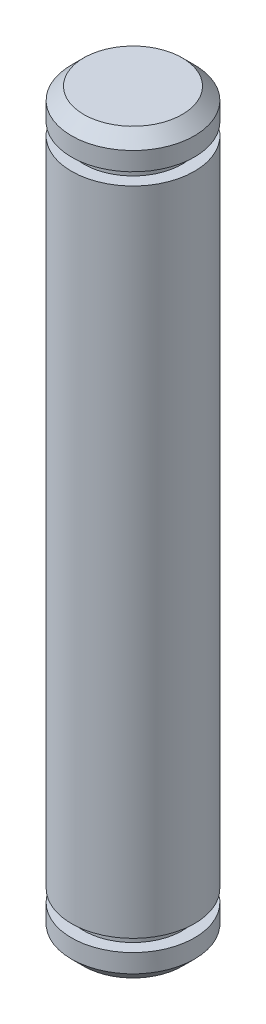
ISO-10303-21;
HEADER;
FILE_DESCRIPTION(('STEP AP214'),'2;1');
FILE_NAME('part.step','',(''),(''),'','','');
FILE_SCHEMA(('AUTOMOTIVE_DESIGN { 1 0 10303 214 1 1 1 1 }'));
ENDSEC;
DATA;
#1=APPLICATION_CONTEXT('core data for automotive mechanical design processes');
#2=APPLICATION_PROTOCOL_DEFINITION('international standard','automotive_design',2000,#1);
#3=PRODUCT_CONTEXT('',#1,'mechanical');
#4=PRODUCT('Part','Part','',(#3));
#5=PRODUCT_RELATED_PRODUCT_CATEGORY('part','',(#4));
#6=PRODUCT_DEFINITION_FORMATION('','',#4);
#7=PRODUCT_DEFINITION_CONTEXT('part definition',#1,'design');
#8=PRODUCT_DEFINITION('design','',#6,#7);
#9=PRODUCT_DEFINITION_SHAPE('','',#8);
#10=(LENGTH_UNIT() NAMED_UNIT(*) SI_UNIT(.MILLI.,.METRE.));
#11=(NAMED_UNIT(*) PLANE_ANGLE_UNIT() SI_UNIT($,.RADIAN.));
#12=(NAMED_UNIT(*) SI_UNIT($,.STERADIAN.) SOLID_ANGLE_UNIT());
#13=UNCERTAINTY_MEASURE_WITH_UNIT(LENGTH_MEASURE(1.E-05),#10,'distance_accuracy_value','');
#14=(GEOMETRIC_REPRESENTATION_CONTEXT(3) GLOBAL_UNCERTAINTY_ASSIGNED_CONTEXT((#13)) GLOBAL_UNIT_ASSIGNED_CONTEXT((#10,
#11,#12)) REPRESENTATION_CONTEXT('',''));
#15=CARTESIAN_POINT('',(0.,0.,0.));
#16=DIRECTION('',(0.,0.,1.));
#17=DIRECTION('',(1.,0.,0.));
#18=AXIS2_PLACEMENT_3D('',#15,#16,#17);
#19=CARTESIAN_POINT('',(0.,60.,0.));
#20=DIRECTION('',(0.,-1.,0.));
#21=DIRECTION('',(0.,0.,-1.));
#22=AXIS2_PLACEMENT_3D('',#19,#20,#21);
#23=CYLINDRICAL_SURFACE('',#22,5.);
#24=CARTESIAN_POINT('',(0.,3.5,0.));
#25=DIRECTION('',(0.,-1.,0.));
#26=DIRECTION('',(0.,0.,-1.));
#27=AXIS2_PLACEMENT_3D('',#24,#25,#26);
#28=CIRCLE('',#27,5.);
#29=CARTESIAN_POINT('',(0.,3.5,-5.));
#30=VERTEX_POINT('',#29);
#31=EDGE_CURVE('E58',#30,#30,#28,.T.);
#32=ORIENTED_EDGE('',*,*,#31,.F.);
#33=EDGE_LOOP('',(#32));
#34=FACE_BOUND('',#33,.T.);
#35=CARTESIAN_POINT('',(0.,56.5,0.));
#36=DIRECTION('',(0.,1.,0.));
#37=DIRECTION('',(0.,0.,1.));
#38=AXIS2_PLACEMENT_3D('',#35,#36,#37);
#39=CIRCLE('',#38,5.);
#40=CARTESIAN_POINT('',(0.,56.5,5.));
#41=VERTEX_POINT('',#40);
#42=EDGE_CURVE('E42',#41,#41,#39,.T.);
#43=ORIENTED_EDGE('',*,*,#42,.F.);
#44=EDGE_LOOP('',(#43));
#45=FACE_BOUND('',#44,.T.);
#46=ADVANCED_FACE('F37',(#34,#45),#23,.T.);
#47=CARTESIAN_POINT('',(0.,3.5,0.));
#48=DIRECTION('',(0.,-1.,0.));
#49=DIRECTION('',(0.,0.,-1.));
#50=AXIS2_PLACEMENT_3D('',#47,#48,#49);
#51=PLANE('',#50);
#52=CARTESIAN_POINT('',(0.,3.5,0.));
#53=DIRECTION('',(0.,-1.,0.));
#54=DIRECTION('',(0.,0.,-1.));
#55=AXIS2_PLACEMENT_3D('',#52,#53,#54);
#56=CIRCLE('',#55,3.99999999999999);
#57=CARTESIAN_POINT('',(0.,3.5,-3.99999999999999));
#58=VERTEX_POINT('',#57);
#59=EDGE_CURVE('E59',#58,#58,#56,.T.);
#60=ORIENTED_EDGE('',*,*,#59,.F.);
#61=EDGE_LOOP('',(#60));
#62=FACE_BOUND('',#61,.T.);
#63=ORIENTED_EDGE('',*,*,#31,.T.);
#64=EDGE_LOOP('',(#63));
#65=FACE_BOUND('',#64,.T.);
#66=ADVANCED_FACE('F105',(#62,#65),#51,.T.);
#67=CARTESIAN_POINT('',(0.,2.5,0.));
#68=DIRECTION('',(0.,-1.,0.));
#69=DIRECTION('',(0.,0.,-1.));
#70=AXIS2_PLACEMENT_3D('',#67,#68,#69);
#71=PLANE('',#70);
#72=CARTESIAN_POINT('',(0.,2.5,0.));
#73=DIRECTION('',(0.,-1.,0.));
#74=DIRECTION('',(0.,0.,-1.));
#75=AXIS2_PLACEMENT_3D('',#72,#73,#74);
#76=CIRCLE('',#75,3.99999999999999);
#77=CARTESIAN_POINT('',(0.,2.5,-3.99999999999999));
#78=VERTEX_POINT('',#77);
#79=EDGE_CURVE('E68',#78,#78,#76,.T.);
#80=ORIENTED_EDGE('',*,*,#79,.T.);
#81=EDGE_LOOP('',(#80));
#82=FACE_BOUND('',#81,.T.);
#83=CARTESIAN_POINT('',(0.,2.5,0.));
#84=DIRECTION('',(0.,-1.,0.));
#85=DIRECTION('',(0.,0.,-1.));
#86=AXIS2_PLACEMENT_3D('',#83,#84,#85);
#87=CIRCLE('',#86,5.);
#88=CARTESIAN_POINT('',(0.,2.5,-5.));
#89=VERTEX_POINT('',#88);
#90=EDGE_CURVE('E55',#89,#89,#87,.T.);
#91=ORIENTED_EDGE('',*,*,#90,.F.);
#92=EDGE_LOOP('',(#91));
#93=FACE_BOUND('',#92,.T.);
#94=ADVANCED_FACE('F110',(#82,#93),#71,.F.);
#95=CARTESIAN_POINT('',(0.,3.5,0.));
#96=DIRECTION('',(0.,-1.,0.));
#97=DIRECTION('',(0.,0.,-1.));
#98=AXIS2_PLACEMENT_3D('',#95,#96,#97);
#99=CYLINDRICAL_SURFACE('',#98,3.99999999999999);
#100=ORIENTED_EDGE('',*,*,#59,.T.);
#101=EDGE_LOOP('',(#100));
#102=FACE_BOUND('',#101,.T.);
#103=ORIENTED_EDGE('',*,*,#79,.F.);
#104=EDGE_LOOP('',(#103));
#105=FACE_BOUND('',#104,.T.);
#106=ADVANCED_FACE('F99',(#102,#105),#99,.T.);
#107=CARTESIAN_POINT('',(0.,0.,0.));
#108=DIRECTION('',(0.,1.,0.));
#109=DIRECTION('',(0.,0.,1.));
#110=AXIS2_PLACEMENT_3D('',#107,#108,#109);
#111=PLANE('',#110);
#112=CARTESIAN_POINT('',(0.,0.,0.));
#113=DIRECTION('',(0.,1.,0.));
#114=DIRECTION('',(0.,0.,1.));
#115=AXIS2_PLACEMENT_3D('',#112,#113,#114);
#116=CIRCLE('',#115,3.99999999999999);
#117=CARTESIAN_POINT('',(0.,0.,3.99999999999999));
#118=VERTEX_POINT('',#117);
#119=EDGE_CURVE('E46',#118,#118,#116,.F.);
#120=ORIENTED_EDGE('',*,*,#119,.T.);
#121=EDGE_LOOP('',(#120));
#122=FACE_BOUND('',#121,.T.);
#123=ADVANCED_FACE('F89',(#122),#111,.F.);
#124=CARTESIAN_POINT('',(0.,1.00000000000001,0.));
#125=DIRECTION('',(0.,1.,0.));
#126=DIRECTION('',(0.,0.,1.));
#127=AXIS2_PLACEMENT_3D('',#124,#125,#126);
#128=CONICAL_SURFACE('',#127,5.,0.785398163397446);
#129=ORIENTED_EDGE('',*,*,#119,.F.);
#130=EDGE_LOOP('',(#129));
#131=FACE_BOUND('',#130,.T.);
#132=CARTESIAN_POINT('',(0.,1.00000000000001,0.));
#133=DIRECTION('',(0.,1.,0.));
#134=DIRECTION('',(0.,0.,1.));
#135=AXIS2_PLACEMENT_3D('',#132,#133,#134);
#136=CIRCLE('',#135,5.);
#137=CARTESIAN_POINT('',(0.,1.00000000000001,5.));
#138=VERTEX_POINT('',#137);
#139=EDGE_CURVE('E51',#138,#138,#136,.T.);
#140=ORIENTED_EDGE('',*,*,#139,.F.);
#141=EDGE_LOOP('',(#140));
#142=FACE_BOUND('',#141,.T.);
#143=ADVANCED_FACE('F87',(#131,#142),#128,.T.);
#144=ORIENTED_EDGE('',*,*,#90,.T.);
#145=EDGE_LOOP('',(#144));
#146=FACE_BOUND('',#145,.T.);
#147=ORIENTED_EDGE('',*,*,#139,.T.);
#148=EDGE_LOOP('',(#147));
#149=FACE_BOUND('',#148,.T.);
#150=ADVANCED_FACE('F85',(#146,#149),#23,.T.);
#151=CARTESIAN_POINT('',(0.,56.5,0.));
#152=DIRECTION('',(0.,1.,0.));
#153=DIRECTION('',(0.,0.,1.));
#154=AXIS2_PLACEMENT_3D('',#151,#152,#153);
#155=PLANE('',#154);
#156=CARTESIAN_POINT('',(0.,56.5,0.));
#157=DIRECTION('',(0.,1.,0.));
#158=DIRECTION('',(0.,0.,1.));
#159=AXIS2_PLACEMENT_3D('',#156,#157,#158);
#160=CIRCLE('',#159,3.99999999999998);
#161=CARTESIAN_POINT('',(0.,56.5,3.99999999999998));
#162=VERTEX_POINT('',#161);
#163=EDGE_CURVE('E64',#162,#162,#160,.T.);
#164=ORIENTED_EDGE('',*,*,#163,.F.);
#165=EDGE_LOOP('',(#164));
#166=FACE_BOUND('',#165,.T.);
#167=ORIENTED_EDGE('',*,*,#42,.T.);
#168=EDGE_LOOP('',(#167));
#169=FACE_BOUND('',#168,.T.);
#170=ADVANCED_FACE('F95',(#166,#169),#155,.T.);
#171=CARTESIAN_POINT('',(0.,57.5,0.));
#172=DIRECTION('',(0.,1.,0.));
#173=DIRECTION('',(0.,0.,1.));
#174=AXIS2_PLACEMENT_3D('',#171,#172,#173);
#175=PLANE('',#174);
#176=CARTESIAN_POINT('',(0.,57.5,0.));
#177=DIRECTION('',(0.,1.,0.));
#178=DIRECTION('',(0.,0.,1.));
#179=AXIS2_PLACEMENT_3D('',#176,#177,#178);
#180=CIRCLE('',#179,3.99999999999998);
#181=CARTESIAN_POINT('',(0.,57.5,3.99999999999998));
#182=VERTEX_POINT('',#181);
#183=EDGE_CURVE('E70',#182,#182,#180,.T.);
#184=ORIENTED_EDGE('',*,*,#183,.T.);
#185=EDGE_LOOP('',(#184));
#186=FACE_BOUND('',#185,.T.);
#187=CARTESIAN_POINT('',(0.,57.5,0.));
#188=DIRECTION('',(0.,1.,0.));
#189=DIRECTION('',(0.,0.,1.));
#190=AXIS2_PLACEMENT_3D('',#187,#188,#189);
#191=CIRCLE('',#190,5.);
#192=CARTESIAN_POINT('',(0.,57.5,5.));
#193=VERTEX_POINT('',#192);
#194=EDGE_CURVE('E62',#193,#193,#191,.T.);
#195=ORIENTED_EDGE('',*,*,#194,.F.);
#196=EDGE_LOOP('',(#195));
#197=FACE_BOUND('',#196,.T.);
#198=ADVANCED_FACE('F132',(#186,#197),#175,.F.);
#199=CARTESIAN_POINT('',(0.,56.5,0.));
#200=DIRECTION('',(0.,1.,0.));
#201=DIRECTION('',(0.,0.,1.));
#202=AXIS2_PLACEMENT_3D('',#199,#200,#201);
#203=CYLINDRICAL_SURFACE('',#202,3.99999999999998);
#204=ORIENTED_EDGE('',*,*,#163,.T.);
#205=EDGE_LOOP('',(#204));
#206=FACE_BOUND('',#205,.T.);
#207=ORIENTED_EDGE('',*,*,#183,.F.);
#208=EDGE_LOOP('',(#207));
#209=FACE_BOUND('',#208,.T.);
#210=ADVANCED_FACE('F127',(#206,#209),#203,.T.);
#211=CARTESIAN_POINT('',(0.,60.,0.));
#212=DIRECTION('',(0.,1.,0.));
#213=DIRECTION('',(0.,0.,1.));
#214=AXIS2_PLACEMENT_3D('',#211,#212,#213);
#215=PLANE('',#214);
#216=CARTESIAN_POINT('',(0.,60.,0.));
#217=DIRECTION('',(0.,1.,0.));
#218=DIRECTION('',(0.,0.,1.));
#219=AXIS2_PLACEMENT_3D('',#216,#217,#218);
#220=CIRCLE('',#219,3.99999999999998);
#221=CARTESIAN_POINT('',(0.,60.,3.99999999999998));
#222=VERTEX_POINT('',#221);
#223=EDGE_CURVE('E10',#222,#222,#220,.T.);
#224=ORIENTED_EDGE('',*,*,#223,.T.);
#225=EDGE_LOOP('',(#224));
#226=FACE_BOUND('',#225,.T.);
#227=ADVANCED_FACE('F119',(#226),#215,.T.);
#228=CARTESIAN_POINT('',(0.,60.,0.));
#229=DIRECTION('',(0.,-1.,0.));
#230=DIRECTION('',(0.,0.,-1.));
#231=AXIS2_PLACEMENT_3D('',#228,#229,#230);
#232=CONICAL_SURFACE('',#231,3.99999999999998,0.78539816339745);
#233=CARTESIAN_POINT('',(0.,59.,0.));
#234=DIRECTION('',(0.,1.,0.));
#235=DIRECTION('',(0.,0.,1.));
#236=AXIS2_PLACEMENT_3D('',#233,#234,#235);
#237=CIRCLE('',#236,5.);
#238=CARTESIAN_POINT('',(0.,59.,5.));
#239=VERTEX_POINT('',#238);
#240=EDGE_CURVE('E61',#239,#239,#237,.F.);
#241=ORIENTED_EDGE('',*,*,#240,.F.);
#242=EDGE_LOOP('',(#241));
#243=FACE_BOUND('',#242,.T.);
#244=ORIENTED_EDGE('',*,*,#223,.F.);
#245=EDGE_LOOP('',(#244));
#246=FACE_BOUND('',#245,.T.);
#247=ADVANCED_FACE('F40',(#243,#246),#232,.T.);
#248=ORIENTED_EDGE('',*,*,#194,.T.);
#249=EDGE_LOOP('',(#248));
#250=FACE_BOUND('',#249,.T.);
#251=ORIENTED_EDGE('',*,*,#240,.T.);
#252=EDGE_LOOP('',(#251));
#253=FACE_BOUND('',#252,.T.);
#254=ADVANCED_FACE('F98',(#250,#253),#23,.T.);
#255=CLOSED_SHELL('',(#46,#66,#94,#106,#123,#143,#150,#170,#198,#210,#227,#247,#254));
#256=MANIFOLD_SOLID_BREP('B2',#255);
#257=ADVANCED_BREP_SHAPE_REPRESENTATION('',(#18,#256),#14);
#258=SHAPE_DEFINITION_REPRESENTATION(#9,#257);
ENDSEC;
END-ISO-10303-21;
